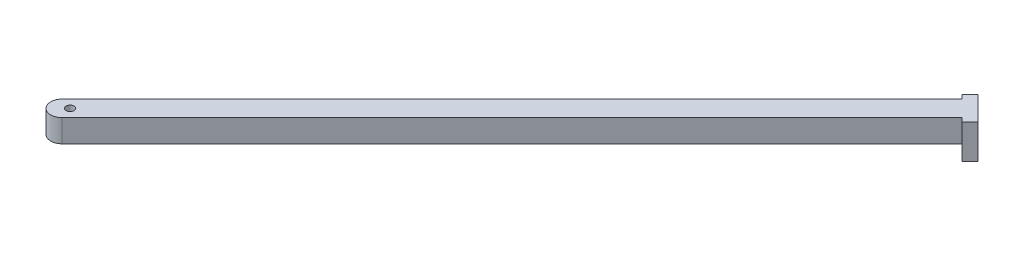
ISO-10303-21;
HEADER;
FILE_DESCRIPTION(('STEP AP214'),'2;1');
FILE_NAME('part.step','',(''),(''),'','','');
FILE_SCHEMA(('AUTOMOTIVE_DESIGN { 1 0 10303 214 1 1 1 1 }'));
ENDSEC;
DATA;
#1=APPLICATION_CONTEXT('core data for automotive mechanical design processes');
#2=APPLICATION_PROTOCOL_DEFINITION('international standard','automotive_design',2000,#1);
#3=PRODUCT_CONTEXT('',#1,'mechanical');
#4=PRODUCT('Part','Part','',(#3));
#5=PRODUCT_RELATED_PRODUCT_CATEGORY('part','',(#4));
#6=PRODUCT_DEFINITION_FORMATION('','',#4);
#7=PRODUCT_DEFINITION_CONTEXT('part definition',#1,'design');
#8=PRODUCT_DEFINITION('design','',#6,#7);
#9=PRODUCT_DEFINITION_SHAPE('','',#8);
#10=(LENGTH_UNIT() NAMED_UNIT(*) SI_UNIT(.MILLI.,.METRE.));
#11=(NAMED_UNIT(*) PLANE_ANGLE_UNIT() SI_UNIT($,.RADIAN.));
#12=(NAMED_UNIT(*) SI_UNIT($,.STERADIAN.) SOLID_ANGLE_UNIT());
#13=UNCERTAINTY_MEASURE_WITH_UNIT(LENGTH_MEASURE(1.E-05),#10,'distance_accuracy_value','');
#14=(GEOMETRIC_REPRESENTATION_CONTEXT(3) GLOBAL_UNCERTAINTY_ASSIGNED_CONTEXT((#13)) GLOBAL_UNIT_ASSIGNED_CONTEXT((#10,
#11,#12)) REPRESENTATION_CONTEXT('',''));
#15=CARTESIAN_POINT('',(0.,0.,0.));
#16=DIRECTION('',(0.,0.,1.));
#17=DIRECTION('',(1.,0.,0.));
#18=AXIS2_PLACEMENT_3D('',#15,#16,#17);
#19=CARTESIAN_POINT('',(7.07106781186548,-73.,7.07106781186547));
#20=DIRECTION('',(-0.707106781186547,0.,-0.707106781186548));
#21=DIRECTION('',(-0.707106781186548,0.,0.707106781186547));
#22=AXIS2_PLACEMENT_3D('',#19,#20,#21);
#23=PLANE('',#22);
#24=DIRECTION('',(0.707106781186548,0.,-0.707106781186547));
#25=VECTOR('',#24,1.);
#26=CARTESIAN_POINT('',(7.07106781186548,-93.,7.07106781186547));
#27=LINE('',#26,#25);
#28=CARTESIAN_POINT('',(-419.038059222874,-93.,433.180194846605));
#29=VERTEX_POINT('',#28);
#30=CARTESIAN_POINT('',(-22.6274169979694,-93.,36.7695526217004));
#31=VERTEX_POINT('',#30);
#32=EDGE_CURVE('E150',#29,#31,#27,.T.);
#33=ORIENTED_EDGE('',*,*,#32,.T.);
#34=DIRECTION('',(0.,1.,0.));
#35=VECTOR('',#34,1.);
#36=CARTESIAN_POINT('',(-22.6274169979694,-73.,36.7695526217004));
#37=LINE('',#36,#35);
#38=CARTESIAN_POINT('',(-22.6274169979694,-73.,36.7695526217004));
#39=VERTEX_POINT('',#38);
#40=EDGE_CURVE('E133',#31,#39,#37,.T.);
#41=ORIENTED_EDGE('',*,*,#40,.T.);
#42=DIRECTION('',(0.707106781186548,0.,-0.707106781186547));
#43=VECTOR('',#42,1.);
#44=CARTESIAN_POINT('',(7.07106781186548,-73.,7.07106781186547));
#45=LINE('',#44,#43);
#46=CARTESIAN_POINT('',(-419.038059222874,-73.,433.180194846605));
#47=VERTEX_POINT('',#46);
#48=EDGE_CURVE('E144',#47,#39,#45,.T.);
#49=ORIENTED_EDGE('',*,*,#48,.F.);
#50=DIRECTION('',(0.,-1.,0.));
#51=VECTOR('',#50,1.);
#52=CARTESIAN_POINT('',(-419.038059222874,-73.,433.180194846605));
#53=LINE('',#52,#51);
#54=EDGE_CURVE('E43',#47,#29,#53,.T.);
#55=ORIENTED_EDGE('',*,*,#54,.T.);
#56=EDGE_LOOP('',(#33,#41,#49,#55));
#57=FACE_BOUND('',#56,.T.);
#58=ADVANCED_FACE('F35',(#57),#23,.F.);
#59=CARTESIAN_POINT('',(-440.251262658471,-73.,426.10912703474));
#60=DIRECTION('',(0.707106781186547,0.,0.707106781186548));
#61=DIRECTION('',(0.707106781186548,0.,-0.707106781186547));
#62=AXIS2_PLACEMENT_3D('',#59,#60,#61);
#63=PLANE('',#62);
#64=DIRECTION('',(-0.707106781186548,0.,0.707106781186547));
#65=VECTOR('',#64,1.);
#66=CARTESIAN_POINT('',(-440.251262658471,-73.,426.10912703474));
#67=LINE('',#66,#65);
#68=CARTESIAN_POINT('',(-36.7695526217005,-73.,22.6274169979696));
#69=VERTEX_POINT('',#68);
#70=CARTESIAN_POINT('',(-433.180194846605,-73.,419.038059222874));
#71=VERTEX_POINT('',#70);
#72=EDGE_CURVE('E146',#69,#71,#67,.T.);
#73=ORIENTED_EDGE('',*,*,#72,.F.);
#74=DIRECTION('',(0.,-1.,0.));
#75=VECTOR('',#74,1.);
#76=CARTESIAN_POINT('',(-36.7695526217005,-72.9999999999999,22.6274169979696));
#77=LINE('',#76,#75);
#78=CARTESIAN_POINT('',(-36.7695526217005,-93.,22.6274169979696));
#79=VERTEX_POINT('',#78);
#80=EDGE_CURVE('E130',#69,#79,#77,.T.);
#81=ORIENTED_EDGE('',*,*,#80,.T.);
#82=DIRECTION('',(-0.707106781186548,0.,0.707106781186547));
#83=VECTOR('',#82,1.);
#84=CARTESIAN_POINT('',(-440.251262658471,-93.,426.10912703474));
#85=LINE('',#84,#83);
#86=CARTESIAN_POINT('',(-433.180194846605,-93.,419.038059222874));
#87=VERTEX_POINT('',#86);
#88=EDGE_CURVE('E147',#79,#87,#85,.T.);
#89=ORIENTED_EDGE('',*,*,#88,.T.);
#90=DIRECTION('',(0.,-1.,0.));
#91=VECTOR('',#90,1.);
#92=CARTESIAN_POINT('',(-433.180194846605,-73.,419.038059222874));
#93=LINE('',#92,#91);
#94=EDGE_CURVE('E158',#87,#71,#93,.F.);
#95=ORIENTED_EDGE('',*,*,#94,.T.);
#96=EDGE_LOOP('',(#73,#81,#89,#95));
#97=FACE_BOUND('',#96,.T.);
#98=ADVANCED_FACE('F179',(#97),#63,.F.);
#99=CARTESIAN_POINT('',(0.,-73.,0.));
#100=DIRECTION('',(0.,1.,0.));
#101=DIRECTION('',(0.,0.,1.));
#102=AXIS2_PLACEMENT_3D('',#99,#100,#101);
#103=PLANE('',#102);
#104=CARTESIAN_POINT('',(-422.573593128807,-73.,422.573593128807));
#105=DIRECTION('',(0.,-1.,0.));
#106=DIRECTION('',(0.,0.,-1.));
#107=AXIS2_PLACEMENT_3D('',#104,#105,#106);
#108=CIRCLE('',#107,3.50000000000002);
#109=CARTESIAN_POINT('',(-422.573593128807,-73.,419.073593128807));
#110=VERTEX_POINT('',#109);
#111=EDGE_CURVE('E188',#110,#110,#108,.T.);
#112=ORIENTED_EDGE('',*,*,#111,.T.);
#113=EDGE_LOOP('',(#112));
#114=FACE_BOUND('',#113,.T.);
#115=ORIENTED_EDGE('',*,*,#48,.T.);
#116=DIRECTION('',(-0.707106781186556,0.,-0.707106781186539));
#117=VECTOR('',#116,1.);
#118=CARTESIAN_POINT('',(-19.0918830920416,-73.,40.3050865276281));
#119=LINE('',#118,#117);
#120=CARTESIAN_POINT('',(-19.0918830920416,-73.,40.3050865276281));
#121=VERTEX_POINT('',#120);
#122=EDGE_CURVE('E182',#121,#39,#119,.T.);
#123=ORIENTED_EDGE('',*,*,#122,.F.);
#124=DIRECTION('',(0.707106781186539,0.,-0.707106781186556));
#125=VECTOR('',#124,1.);
#126=CARTESIAN_POINT('',(-19.0918830920416,-73.,40.3050865276281));
#127=LINE('',#126,#125);
#128=CARTESIAN_POINT('',(-12.0208152801762,-73.,33.2340187157626));
#129=VERTEX_POINT('',#128);
#130=EDGE_CURVE('E135',#121,#129,#127,.T.);
#131=ORIENTED_EDGE('',*,*,#130,.T.);
#132=DIRECTION('',(-0.707106781186556,0.,-0.707106781186539));
#133=VECTOR('',#132,1.);
#134=CARTESIAN_POINT('',(-22.6274169979692,-73.,22.6274169979698));
#135=LINE('',#134,#133);
#136=CARTESIAN_POINT('',(-33.2340187157729,-73.,12.0208152801664));
#137=VERTEX_POINT('',#136);
#138=EDGE_CURVE('E141',#129,#137,#135,.T.);
#139=ORIENTED_EDGE('',*,*,#138,.T.);
#140=DIRECTION('',(0.707106781186539,0.,-0.707106781186556));
#141=VECTOR('',#140,1.);
#142=CARTESIAN_POINT('',(-40.3050865276383,-73.,19.091883092032));
#143=LINE('',#142,#141);
#144=CARTESIAN_POINT('',(-40.3050865276383,-73.,19.091883092032));
#145=VERTEX_POINT('',#144);
#146=EDGE_CURVE('E181',#145,#137,#143,.T.);
#147=ORIENTED_EDGE('',*,*,#146,.F.);
#148=EDGE_CURVE('E121',#69,#145,#119,.T.);
#149=ORIENTED_EDGE('',*,*,#148,.F.);
#150=ORIENTED_EDGE('',*,*,#72,.T.);
#151=CARTESIAN_POINT('',(-426.10912703474,-73.,426.10912703474));
#152=DIRECTION('',(0.,1.,0.));
#153=DIRECTION('',(0.,0.,1.));
#154=AXIS2_PLACEMENT_3D('',#151,#152,#153);
#155=CIRCLE('',#154,10.);
#156=CARTESIAN_POINT('',(-433.180194846605,-73.,433.180194846605));
#157=VERTEX_POINT('',#156);
#158=EDGE_CURVE('E50',#71,#157,#155,.T.);
#159=ORIENTED_EDGE('',*,*,#158,.T.);
#160=CARTESIAN_POINT('',(-426.10912703474,-73.,426.10912703474));
#161=DIRECTION('',(0.,1.,0.));
#162=DIRECTION('',(0.,0.,1.));
#163=AXIS2_PLACEMENT_3D('',#160,#161,#162);
#164=CIRCLE('',#163,10.);
#165=EDGE_CURVE('E54',#157,#47,#164,.T.);
#166=ORIENTED_EDGE('',*,*,#165,.T.);
#167=EDGE_LOOP('',(#115,#123,#131,#139,#147,#149,#150,#159,#166));
#168=FACE_BOUND('',#167,.T.);
#169=ADVANCED_FACE('F180',(#114,#168),#103,.T.);
#170=CARTESIAN_POINT('',(0.,-93.,0.));
#171=DIRECTION('',(0.,1.,0.));
#172=DIRECTION('',(0.,0.,1.));
#173=AXIS2_PLACEMENT_3D('',#170,#171,#172);
#174=PLANE('',#173);
#175=CARTESIAN_POINT('',(-422.573593128807,-93.,422.573593128807));
#176=DIRECTION('',(0.,-1.,0.));
#177=DIRECTION('',(0.,0.,-1.));
#178=AXIS2_PLACEMENT_3D('',#175,#176,#177);
#179=CIRCLE('',#178,3.50000000000002);
#180=CARTESIAN_POINT('',(-422.573593128807,-93.,419.073593128807));
#181=VERTEX_POINT('',#180);
#182=EDGE_CURVE('E225',#181,#181,#179,.T.);
#183=ORIENTED_EDGE('',*,*,#182,.F.);
#184=EDGE_LOOP('',(#183));
#185=FACE_BOUND('',#184,.T.);
#186=ORIENTED_EDGE('',*,*,#88,.F.);
#187=DIRECTION('',(0.707106781186556,0.,0.707106781186539));
#188=VECTOR('',#187,1.);
#189=CARTESIAN_POINT('',(-29.6984848098346,-93.,29.6984848098353));
#190=LINE('',#189,#188);
#191=EDGE_CURVE('E11',#79,#31,#190,.T.);
#192=ORIENTED_EDGE('',*,*,#191,.T.);
#193=ORIENTED_EDGE('',*,*,#32,.F.);
#194=CARTESIAN_POINT('',(-426.10912703474,-93.,426.10912703474));
#195=DIRECTION('',(0.,1.,0.));
#196=DIRECTION('',(0.,0.,1.));
#197=AXIS2_PLACEMENT_3D('',#194,#195,#196);
#198=CIRCLE('',#197,10.);
#199=CARTESIAN_POINT('',(-433.180194846605,-93.,433.180194846605));
#200=VERTEX_POINT('',#199);
#201=EDGE_CURVE('E149',#29,#200,#198,.F.);
#202=ORIENTED_EDGE('',*,*,#201,.T.);
#203=CARTESIAN_POINT('',(-426.10912703474,-93.,426.10912703474));
#204=DIRECTION('',(0.,1.,0.));
#205=DIRECTION('',(0.,0.,1.));
#206=AXIS2_PLACEMENT_3D('',#203,#204,#205);
#207=CIRCLE('',#206,10.);
#208=EDGE_CURVE('E155',#200,#87,#207,.F.);
#209=ORIENTED_EDGE('',*,*,#208,.T.);
#210=EDGE_LOOP('',(#186,#192,#193,#202,#209));
#211=FACE_BOUND('',#210,.T.);
#212=ADVANCED_FACE('F176',(#185,#211),#174,.F.);
#213=CARTESIAN_POINT('',(-426.10912703474,-73.,426.10912703474));
#214=DIRECTION('',(0.,-1.,0.));
#215=DIRECTION('',(0.,0.,-1.));
#216=AXIS2_PLACEMENT_3D('',#213,#214,#215);
#217=CYLINDRICAL_SURFACE('',#216,10.);
#218=ORIENTED_EDGE('',*,*,#54,.F.);
#219=ORIENTED_EDGE('',*,*,#165,.F.);
#220=DIRECTION('',(0.,-1.,0.));
#221=VECTOR('',#220,1.);
#222=CARTESIAN_POINT('',(-433.180194846605,-73.,433.180194846605));
#223=LINE('',#222,#221);
#224=EDGE_CURVE('E143',#200,#157,#223,.F.);
#225=ORIENTED_EDGE('',*,*,#224,.F.);
#226=ORIENTED_EDGE('',*,*,#201,.F.);
#227=EDGE_LOOP('',(#218,#219,#225,#226));
#228=FACE_BOUND('',#227,.T.);
#229=ADVANCED_FACE('F37',(#228),#217,.T.);
#230=CARTESIAN_POINT('',(-426.10912703474,-73.,426.10912703474));
#231=DIRECTION('',(0.,-1.,0.));
#232=DIRECTION('',(0.,0.,-1.));
#233=AXIS2_PLACEMENT_3D('',#230,#231,#232);
#234=CYLINDRICAL_SURFACE('',#233,10.);
#235=ORIENTED_EDGE('',*,*,#158,.F.);
#236=ORIENTED_EDGE('',*,*,#94,.F.);
#237=ORIENTED_EDGE('',*,*,#208,.F.);
#238=ORIENTED_EDGE('',*,*,#224,.T.);
#239=EDGE_LOOP('',(#235,#236,#237,#238));
#240=FACE_BOUND('',#239,.T.);
#241=ADVANCED_FACE('F167',(#240),#234,.T.);
#242=CARTESIAN_POINT('',(-38.7743447632254,-53.,6.480489232714));
#243=DIRECTION('',(0.707106781186539,0.,-0.707106781186556));
#244=DIRECTION('',(-0.707106781186556,0.,-0.707106781186539));
#245=AXIS2_PLACEMENT_3D('',#242,#243,#244);
#246=PLANE('',#245);
#247=DIRECTION('',(0.,-1.,0.));
#248=VECTOR('',#247,1.);
#249=CARTESIAN_POINT('',(-33.2340187157729,-73.,12.0208152801664));
#250=LINE('',#249,#248);
#251=CARTESIAN_POINT('',(-33.2340187157729,-103.,12.0208152801664));
#252=VERTEX_POINT('',#251);
#253=EDGE_CURVE('E129',#137,#252,#250,.T.);
#254=ORIENTED_EDGE('',*,*,#253,.F.);
#255=ORIENTED_EDGE('',*,*,#138,.F.);
#256=DIRECTION('',(0.,1.,0.));
#257=VECTOR('',#256,1.);
#258=CARTESIAN_POINT('',(-12.0208152801762,-103.,33.2340187157626));
#259=LINE('',#258,#257);
#260=CARTESIAN_POINT('',(-12.0208152801762,-103.,33.2340187157626));
#261=VERTEX_POINT('',#260);
#262=EDGE_CURVE('E125',#261,#129,#259,.T.);
#263=ORIENTED_EDGE('',*,*,#262,.F.);
#264=DIRECTION('',(0.707106781186556,0.,0.707106781186539));
#265=VECTOR('',#264,1.);
#266=CARTESIAN_POINT('',(-33.2340187157729,-103.,12.0208152801664));
#267=LINE('',#266,#265);
#268=EDGE_CURVE('E187',#252,#261,#267,.T.);
#269=ORIENTED_EDGE('',*,*,#268,.F.);
#270=EDGE_LOOP('',(#254,#255,#263,#269));
#271=FACE_BOUND('',#270,.T.);
#272=ADVANCED_FACE('F199',(#271),#246,.T.);
#273=CARTESIAN_POINT('',(-29.6984848098346,0.,29.6984848098354));
#274=DIRECTION('',(-0.707106781186539,0.,0.707106781186556));
#275=DIRECTION('',(0.707106781186556,0.,0.707106781186539));
#276=AXIS2_PLACEMENT_3D('',#273,#274,#275);
#277=PLANE('',#276);
#278=ORIENTED_EDGE('',*,*,#40,.F.);
#279=ORIENTED_EDGE('',*,*,#191,.F.);
#280=ORIENTED_EDGE('',*,*,#80,.F.);
#281=ORIENTED_EDGE('',*,*,#148,.T.);
#282=DIRECTION('',(0.,-1.,0.));
#283=VECTOR('',#282,1.);
#284=CARTESIAN_POINT('',(-40.3050865276383,-73.,19.091883092032));
#285=LINE('',#284,#283);
#286=CARTESIAN_POINT('',(-40.3050865276383,-103.,19.091883092032));
#287=VERTEX_POINT('',#286);
#288=EDGE_CURVE('E116',#145,#287,#285,.T.);
#289=ORIENTED_EDGE('',*,*,#288,.T.);
#290=DIRECTION('',(0.707106781186556,0.,0.707106781186539));
#291=VECTOR('',#290,1.);
#292=CARTESIAN_POINT('',(-40.3050865276383,-103.,19.091883092032));
#293=LINE('',#292,#291);
#294=CARTESIAN_POINT('',(-19.0918830920416,-103.,40.3050865276281));
#295=VERTEX_POINT('',#294);
#296=EDGE_CURVE('E105',#287,#295,#293,.T.);
#297=ORIENTED_EDGE('',*,*,#296,.T.);
#298=DIRECTION('',(0.,1.,0.));
#299=VECTOR('',#298,1.);
#300=CARTESIAN_POINT('',(-19.0918830920416,-103.,40.3050865276281));
#301=LINE('',#300,#299);
#302=EDGE_CURVE('E115',#295,#121,#301,.T.);
#303=ORIENTED_EDGE('',*,*,#302,.T.);
#304=ORIENTED_EDGE('',*,*,#122,.T.);
#305=EDGE_LOOP('',(#278,#279,#280,#281,#289,#297,#303,#304));
#306=FACE_BOUND('',#305,.T.);
#307=ADVANCED_FACE('F119',(#306),#277,.T.);
#308=CARTESIAN_POINT('',(-40.3050865276383,-73.,19.091883092032));
#309=DIRECTION('',(0.707106781186556,0.,0.707106781186539));
#310=DIRECTION('',(0.707106781186539,0.,-0.707106781186556));
#311=AXIS2_PLACEMENT_3D('',#308,#309,#310);
#312=PLANE('',#311);
#313=ORIENTED_EDGE('',*,*,#253,.T.);
#314=DIRECTION('',(0.707106781186539,0.,-0.707106781186556));
#315=VECTOR('',#314,1.);
#316=CARTESIAN_POINT('',(-40.3050865276383,-103.,19.091883092032));
#317=LINE('',#316,#315);
#318=EDGE_CURVE('E109',#287,#252,#317,.T.);
#319=ORIENTED_EDGE('',*,*,#318,.F.);
#320=ORIENTED_EDGE('',*,*,#288,.F.);
#321=ORIENTED_EDGE('',*,*,#146,.T.);
#322=EDGE_LOOP('',(#313,#319,#320,#321));
#323=FACE_BOUND('',#322,.T.);
#324=ADVANCED_FACE('F127',(#323),#312,.F.);
#325=CARTESIAN_POINT('',(-40.3050865276383,-103.,19.091883092032));
#326=DIRECTION('',(0.,1.,0.));
#327=DIRECTION('',(0.,0.,1.));
#328=AXIS2_PLACEMENT_3D('',#325,#326,#327);
#329=PLANE('',#328);
#330=ORIENTED_EDGE('',*,*,#268,.T.);
#331=DIRECTION('',(0.707106781186539,0.,-0.707106781186556));
#332=VECTOR('',#331,1.);
#333=CARTESIAN_POINT('',(-19.0918830920416,-103.,40.3050865276281));
#334=LINE('',#333,#332);
#335=EDGE_CURVE('E112',#295,#261,#334,.T.);
#336=ORIENTED_EDGE('',*,*,#335,.F.);
#337=ORIENTED_EDGE('',*,*,#296,.F.);
#338=ORIENTED_EDGE('',*,*,#318,.T.);
#339=EDGE_LOOP('',(#330,#336,#337,#338));
#340=FACE_BOUND('',#339,.T.);
#341=ADVANCED_FACE('F107',(#340),#329,.F.);
#342=CARTESIAN_POINT('',(-19.0918830920416,-103.,40.3050865276281));
#343=DIRECTION('',(-0.707106781186556,0.,-0.707106781186539));
#344=DIRECTION('',(-0.707106781186539,0.,0.707106781186556));
#345=AXIS2_PLACEMENT_3D('',#342,#343,#344);
#346=PLANE('',#345);
#347=ORIENTED_EDGE('',*,*,#262,.T.);
#348=ORIENTED_EDGE('',*,*,#130,.F.);
#349=ORIENTED_EDGE('',*,*,#302,.F.);
#350=ORIENTED_EDGE('',*,*,#335,.T.);
#351=EDGE_LOOP('',(#347,#348,#349,#350));
#352=FACE_BOUND('',#351,.T.);
#353=ADVANCED_FACE('F196',(#352),#346,.F.);
#354=CARTESIAN_POINT('',(-422.573593128807,-73.,422.573593128807));
#355=DIRECTION('',(0.,-1.,0.));
#356=DIRECTION('',(0.,0.,-1.));
#357=AXIS2_PLACEMENT_3D('',#354,#355,#356);
#358=CYLINDRICAL_SURFACE('',#357,3.50000000000002);
#359=ORIENTED_EDGE('',*,*,#111,.F.);
#360=EDGE_LOOP('',(#359));
#361=FACE_BOUND('',#360,.T.);
#362=ORIENTED_EDGE('',*,*,#182,.T.);
#363=EDGE_LOOP('',(#362));
#364=FACE_BOUND('',#363,.T.);
#365=ADVANCED_FACE('F231',(#361,#364),#358,.F.);
#366=CLOSED_SHELL('',(#58,#98,#169,#212,#229,#241,#272,#307,#324,#341,#353,#365));
#367=MANIFOLD_SOLID_BREP('B2',#366);
#368=ADVANCED_BREP_SHAPE_REPRESENTATION('',(#18,#367),#14);
#369=SHAPE_DEFINITION_REPRESENTATION(#9,#368);
ENDSEC;
END-ISO-10303-21;
